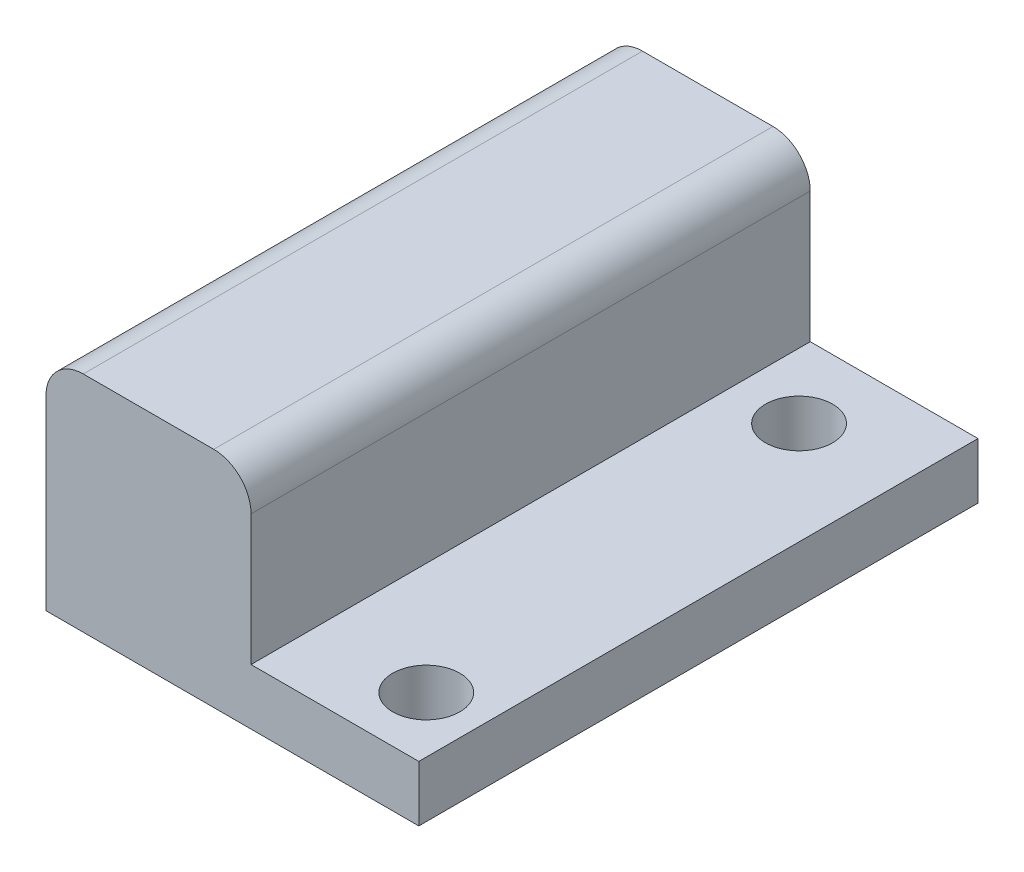
ISO-10303-21;
HEADER;
FILE_DESCRIPTION(('STEP AP214'),'2;1');
FILE_NAME('part.step','',(''),(''),'','','');
FILE_SCHEMA(('AUTOMOTIVE_DESIGN { 1 0 10303 214 1 1 1 1 }'));
ENDSEC;
DATA;
#1=APPLICATION_CONTEXT('core data for automotive mechanical design processes');
#2=APPLICATION_PROTOCOL_DEFINITION('international standard','automotive_design',2000,#1);
#3=PRODUCT_CONTEXT('',#1,'mechanical');
#4=PRODUCT('Part','Part','',(#3));
#5=PRODUCT_RELATED_PRODUCT_CATEGORY('part','',(#4));
#6=PRODUCT_DEFINITION_FORMATION('','',#4);
#7=PRODUCT_DEFINITION_CONTEXT('part definition',#1,'design');
#8=PRODUCT_DEFINITION('design','',#6,#7);
#9=PRODUCT_DEFINITION_SHAPE('','',#8);
#10=(LENGTH_UNIT() NAMED_UNIT(*) SI_UNIT(.MILLI.,.METRE.));
#11=(NAMED_UNIT(*) PLANE_ANGLE_UNIT() SI_UNIT($,.RADIAN.));
#12=(NAMED_UNIT(*) SI_UNIT($,.STERADIAN.) SOLID_ANGLE_UNIT());
#13=UNCERTAINTY_MEASURE_WITH_UNIT(LENGTH_MEASURE(1.E-05),#10,'distance_accuracy_value','');
#14=(GEOMETRIC_REPRESENTATION_CONTEXT(3) GLOBAL_UNCERTAINTY_ASSIGNED_CONTEXT((#13)) GLOBAL_UNIT_ASSIGNED_CONTEXT((#10,
#11,#12)) REPRESENTATION_CONTEXT('',''));
#15=CARTESIAN_POINT('',(0.,0.,0.));
#16=DIRECTION('',(0.,0.,1.));
#17=DIRECTION('',(1.,0.,0.));
#18=AXIS2_PLACEMENT_3D('',#15,#16,#17);
#19=CARTESIAN_POINT('',(0.,3.81,0.));
#20=DIRECTION('',(0.,1.,0.));
#21=DIRECTION('',(0.,0.,1.));
#22=AXIS2_PLACEMENT_3D('',#19,#20,#21);
#23=PLANE('',#22);
#24=DIRECTION('',(0.,0.,-1.));
#25=VECTOR('',#24,1.);
#26=CARTESIAN_POINT('',(-17.272,3.81,29.0764797605896));
#27=LINE('',#26,#25);
#28=CARTESIAN_POINT('',(-17.272,3.81,29.0764797605896));
#29=VERTEX_POINT('',#28);
#30=CARTESIAN_POINT('',(-17.272,3.81,-6.48352023941042));
#31=VERTEX_POINT('',#30);
#32=EDGE_CURVE('E192',#29,#31,#27,.T.);
#33=ORIENTED_EDGE('',*,*,#32,.F.);
#34=DIRECTION('',(-1.,0.,0.));
#35=VECTOR('',#34,1.);
#36=CARTESIAN_POINT('',(-8.382,3.81,29.0764797605896));
#37=LINE('',#36,#35);
#38=CARTESIAN_POINT('',(-8.382,3.81,29.0764797605896));
#39=VERTEX_POINT('',#38);
#40=EDGE_CURVE('E180',#39,#29,#37,.T.);
#41=ORIENTED_EDGE('',*,*,#40,.F.);
#42=DIRECTION('',(0.,0.,1.));
#43=VECTOR('',#42,1.);
#44=CARTESIAN_POINT('',(-8.382,3.81,-6.48352023941042));
#45=LINE('',#44,#43);
#46=CARTESIAN_POINT('',(-8.382,3.81,-6.48352023941042));
#47=VERTEX_POINT('',#46);
#48=EDGE_CURVE('E174',#47,#39,#45,.T.);
#49=ORIENTED_EDGE('',*,*,#48,.F.);
#50=DIRECTION('',(-1.,0.,0.));
#51=VECTOR('',#50,1.);
#52=CARTESIAN_POINT('',(-19.812,3.81,-6.48352023941042));
#53=LINE('',#52,#51);
#54=EDGE_CURVE('E170',#47,#31,#53,.T.);
#55=ORIENTED_EDGE('',*,*,#54,.T.);
#56=EDGE_LOOP('',(#33,#41,#49,#55));
#57=FACE_BOUND('',#56,.T.);
#58=ADVANCED_FACE('F45',(#57),#23,.T.);
#59=DIRECTION('',(0.,0.,-1.));
#60=VECTOR('',#59,1.);
#61=CARTESIAN_POINT('',(-5.842,3.81,31.6164797605896));
#62=LINE('',#61,#60);
#63=CARTESIAN_POINT('',(-5.842,3.81,31.6164797605896));
#64=VERTEX_POINT('',#63);
#65=CARTESIAN_POINT('',(-5.842,3.81,-6.48352023941042));
#66=VERTEX_POINT('',#65);
#67=EDGE_CURVE('E163',#64,#66,#62,.T.);
#68=ORIENTED_EDGE('',*,*,#67,.F.);
#69=DIRECTION('',(1.,0.,0.));
#70=VECTOR('',#69,1.);
#71=CARTESIAN_POINT('',(-19.812,3.81,31.6164797605896));
#72=LINE('',#71,#70);
#73=CARTESIAN_POINT('',(5.588,3.81,31.6164797605896));
#74=VERTEX_POINT('',#73);
#75=EDGE_CURVE('E226',#64,#74,#72,.T.);
#76=ORIENTED_EDGE('',*,*,#75,.T.);
#77=DIRECTION('',(0.,0.,-1.));
#78=VECTOR('',#77,1.);
#79=CARTESIAN_POINT('',(5.588,3.81,-6.48352023941042));
#80=LINE('',#79,#78);
#81=CARTESIAN_POINT('',(5.588,3.81,-6.48352023941042));
#82=VERTEX_POINT('',#81);
#83=EDGE_CURVE('E166',#74,#82,#80,.T.);
#84=ORIENTED_EDGE('',*,*,#83,.T.);
#85=EDGE_CURVE('E152',#82,#66,#53,.T.);
#86=ORIENTED_EDGE('',*,*,#85,.T.);
#87=EDGE_LOOP('',(#68,#76,#84,#86));
#88=FACE_BOUND('',#87,.T.);
#89=CARTESIAN_POINT('',(-1.397,3.81,-1.27652023941042));
#90=DIRECTION('',(0.,1.,0.));
#91=DIRECTION('',(0.,0.,1.));
#92=AXIS2_PLACEMENT_3D('',#89,#90,#91);
#93=CIRCLE('',#92,2.286);
#94=CARTESIAN_POINT('',(-1.397,3.81,-3.56252023941042));
#95=VERTEX_POINT('',#94);
#96=EDGE_CURVE('E218',#95,#95,#93,.T.);
#97=ORIENTED_EDGE('',*,*,#96,.F.);
#98=EDGE_LOOP('',(#97));
#99=FACE_BOUND('',#98,.T.);
#100=CARTESIAN_POINT('',(1.778,3.81,27.2984797605896));
#101=DIRECTION('',(0.,1.,0.));
#102=DIRECTION('',(0.,0.,1.));
#103=AXIS2_PLACEMENT_3D('',#100,#101,#102);
#104=CIRCLE('',#103,2.286);
#105=CARTESIAN_POINT('',(1.778,3.81,25.0124797605896));
#106=VERTEX_POINT('',#105);
#107=EDGE_CURVE('E210',#106,#106,#104,.T.);
#108=ORIENTED_EDGE('',*,*,#107,.F.);
#109=EDGE_LOOP('',(#108));
#110=FACE_BOUND('',#109,.T.);
#111=ADVANCED_FACE('F161',(#88,#99,#110),#23,.T.);
#112=CARTESIAN_POINT('',(0.,0.,0.));
#113=DIRECTION('',(0.,1.,0.));
#114=DIRECTION('',(0.,0.,1.));
#115=AXIS2_PLACEMENT_3D('',#112,#113,#114);
#116=PLANE('',#115);
#117=DIRECTION('',(0.,0.,1.));
#118=VECTOR('',#117,1.);
#119=CARTESIAN_POINT('',(-19.812,0.,-6.48352023941042));
#120=LINE('',#119,#118);
#121=CARTESIAN_POINT('',(-19.812,0.,-6.48352023941042));
#122=VERTEX_POINT('',#121);
#123=CARTESIAN_POINT('',(-19.812,0.,31.6164797605896));
#124=VERTEX_POINT('',#123);
#125=EDGE_CURVE('E222',#122,#124,#120,.T.);
#126=ORIENTED_EDGE('',*,*,#125,.F.);
#127=DIRECTION('',(-1.,0.,0.));
#128=VECTOR('',#127,1.);
#129=CARTESIAN_POINT('',(-19.812,0.,-6.48352023941042));
#130=LINE('',#129,#128);
#131=CARTESIAN_POINT('',(5.588,0.,-6.48352023941042));
#132=VERTEX_POINT('',#131);
#133=EDGE_CURVE('E229',#132,#122,#130,.T.);
#134=ORIENTED_EDGE('',*,*,#133,.F.);
#135=DIRECTION('',(0.,0.,-1.));
#136=VECTOR('',#135,1.);
#137=CARTESIAN_POINT('',(5.588,0.,-6.48352023941042));
#138=LINE('',#137,#136);
#139=CARTESIAN_POINT('',(5.588,0.,31.6164797605896));
#140=VERTEX_POINT('',#139);
#141=EDGE_CURVE('E238',#140,#132,#138,.T.);
#142=ORIENTED_EDGE('',*,*,#141,.F.);
#143=DIRECTION('',(1.,0.,0.));
#144=VECTOR('',#143,1.);
#145=CARTESIAN_POINT('',(-19.812,0.,31.6164797605896));
#146=LINE('',#145,#144);
#147=EDGE_CURVE('E235',#124,#140,#146,.T.);
#148=ORIENTED_EDGE('',*,*,#147,.F.);
#149=EDGE_LOOP('',(#126,#134,#142,#148));
#150=FACE_BOUND('',#149,.T.);
#151=CARTESIAN_POINT('',(-1.397,0.,-1.27652023941042));
#152=DIRECTION('',(0.,1.,0.));
#153=DIRECTION('',(0.,0.,1.));
#154=AXIS2_PLACEMENT_3D('',#151,#152,#153);
#155=CIRCLE('',#154,2.286);
#156=CARTESIAN_POINT('',(-1.397,0.,-3.56252023941042));
#157=VERTEX_POINT('',#156);
#158=EDGE_CURVE('E214',#157,#157,#155,.T.);
#159=ORIENTED_EDGE('',*,*,#158,.T.);
#160=EDGE_LOOP('',(#159));
#161=FACE_BOUND('',#160,.T.);
#162=CARTESIAN_POINT('',(1.778,0.,27.2984797605896));
#163=DIRECTION('',(0.,1.,0.));
#164=DIRECTION('',(0.,0.,1.));
#165=AXIS2_PLACEMENT_3D('',#162,#163,#164);
#166=CIRCLE('',#165,2.286);
#167=CARTESIAN_POINT('',(1.778,0.,25.0124797605896));
#168=VERTEX_POINT('',#167);
#169=EDGE_CURVE('E209',#168,#168,#166,.T.);
#170=ORIENTED_EDGE('',*,*,#169,.T.);
#171=EDGE_LOOP('',(#170));
#172=FACE_BOUND('',#171,.T.);
#173=ADVANCED_FACE('F327',(#150,#161,#172),#116,.F.);
#174=CARTESIAN_POINT('',(-19.812,3.81,-6.48352023941042));
#175=DIRECTION('',(1.,0.,0.));
#176=DIRECTION('',(0.,0.,-1.));
#177=AXIS2_PLACEMENT_3D('',#174,#175,#176);
#178=PLANE('',#177);
#179=DIRECTION('',(0.,-1.,0.));
#180=VECTOR('',#179,1.);
#181=CARTESIAN_POINT('',(-19.812,3.81,31.6164797605896));
#182=LINE('',#181,#180);
#183=CARTESIAN_POINT('',(-19.812,12.7,31.6164797605896));
#184=VERTEX_POINT('',#183);
#185=EDGE_CURVE('E253',#184,#124,#182,.T.);
#186=ORIENTED_EDGE('',*,*,#185,.F.);
#187=DIRECTION('',(0.,0.,1.));
#188=VECTOR('',#187,1.);
#189=CARTESIAN_POINT('',(-19.812,12.7,-6.48352023941042));
#190=LINE('',#189,#188);
#191=CARTESIAN_POINT('',(-19.812,12.7,-6.48352023941042));
#192=VERTEX_POINT('',#191);
#193=EDGE_CURVE('E11',#184,#192,#190,.F.);
#194=ORIENTED_EDGE('',*,*,#193,.T.);
#195=DIRECTION('',(0.,-1.,0.));
#196=VECTOR('',#195,1.);
#197=CARTESIAN_POINT('',(-19.812,3.81,-6.48352023941042));
#198=LINE('',#197,#196);
#199=EDGE_CURVE('E169',#192,#122,#198,.T.);
#200=ORIENTED_EDGE('',*,*,#199,.T.);
#201=ORIENTED_EDGE('',*,*,#125,.T.);
#202=EDGE_LOOP('',(#186,#194,#200,#201));
#203=FACE_BOUND('',#202,.T.);
#204=ADVANCED_FACE('F335',(#203),#178,.F.);
#205=CARTESIAN_POINT('',(-19.812,3.81,31.6164797605896));
#206=DIRECTION('',(0.,0.,-1.));
#207=DIRECTION('',(-1.,0.,0.));
#208=AXIS2_PLACEMENT_3D('',#205,#206,#207);
#209=PLANE('',#208);
#210=DIRECTION('',(0.,-1.,0.));
#211=VECTOR('',#210,1.);
#212=CARTESIAN_POINT('',(-5.842,12.7,31.6164797605896));
#213=LINE('',#212,#211);
#214=CARTESIAN_POINT('',(-5.842,12.7,31.6164797605896));
#215=VERTEX_POINT('',#214);
#216=EDGE_CURVE('E156',#215,#64,#213,.T.);
#217=ORIENTED_EDGE('',*,*,#216,.F.);
#218=CARTESIAN_POINT('',(-8.382,12.7,31.6164797605896));
#219=DIRECTION('',(0.,0.,-1.));
#220=DIRECTION('',(-1.,0.,0.));
#221=AXIS2_PLACEMENT_3D('',#218,#219,#220);
#222=CIRCLE('',#221,2.54);
#223=CARTESIAN_POINT('',(-8.382,15.24,31.6164797605896));
#224=VERTEX_POINT('',#223);
#225=EDGE_CURVE('E54',#215,#224,#222,.F.);
#226=ORIENTED_EDGE('',*,*,#225,.T.);
#227=DIRECTION('',(1.,0.,0.));
#228=VECTOR('',#227,1.);
#229=CARTESIAN_POINT('',(-19.812,15.24,31.6164797605896));
#230=LINE('',#229,#228);
#231=CARTESIAN_POINT('',(-17.272,15.24,31.6164797605896));
#232=VERTEX_POINT('',#231);
#233=EDGE_CURVE('E183',#232,#224,#230,.T.);
#234=ORIENTED_EDGE('',*,*,#233,.F.);
#235=CARTESIAN_POINT('',(-17.272,12.7,31.6164797605896));
#236=DIRECTION('',(0.,0.,-1.));
#237=DIRECTION('',(-1.,0.,0.));
#238=AXIS2_PLACEMENT_3D('',#235,#236,#237);
#239=CIRCLE('',#238,2.54);
#240=EDGE_CURVE('E61',#232,#184,#239,.F.);
#241=ORIENTED_EDGE('',*,*,#240,.T.);
#242=ORIENTED_EDGE('',*,*,#185,.T.);
#243=ORIENTED_EDGE('',*,*,#147,.T.);
#244=DIRECTION('',(0.,-1.,0.));
#245=VECTOR('',#244,1.);
#246=CARTESIAN_POINT('',(5.588,3.81,31.6164797605896));
#247=LINE('',#246,#245);
#248=EDGE_CURVE('E249',#74,#140,#247,.T.);
#249=ORIENTED_EDGE('',*,*,#248,.F.);
#250=ORIENTED_EDGE('',*,*,#75,.F.);
#251=EDGE_LOOP('',(#217,#226,#234,#241,#242,#243,#249,#250));
#252=FACE_BOUND('',#251,.T.);
#253=ADVANCED_FACE('F301',(#252),#209,.F.);
#254=CARTESIAN_POINT('',(5.588,3.81,-6.48352023941042));
#255=DIRECTION('',(-1.,0.,0.));
#256=DIRECTION('',(0.,0.,1.));
#257=AXIS2_PLACEMENT_3D('',#254,#255,#256);
#258=PLANE('',#257);
#259=ORIENTED_EDGE('',*,*,#141,.T.);
#260=DIRECTION('',(0.,-1.,0.));
#261=VECTOR('',#260,1.);
#262=CARTESIAN_POINT('',(5.588,3.81,-6.48352023941042));
#263=LINE('',#262,#261);
#264=EDGE_CURVE('E246',#82,#132,#263,.T.);
#265=ORIENTED_EDGE('',*,*,#264,.F.);
#266=ORIENTED_EDGE('',*,*,#83,.F.);
#267=ORIENTED_EDGE('',*,*,#248,.T.);
#268=EDGE_LOOP('',(#259,#265,#266,#267));
#269=FACE_BOUND('',#268,.T.);
#270=ADVANCED_FACE('F339',(#269),#258,.F.);
#271=CARTESIAN_POINT('',(-19.812,3.81,-6.48352023941042));
#272=DIRECTION('',(0.,0.,1.));
#273=DIRECTION('',(1.,0.,0.));
#274=AXIS2_PLACEMENT_3D('',#271,#272,#273);
#275=PLANE('',#274);
#276=DIRECTION('',(-1.,0.,0.));
#277=VECTOR('',#276,1.);
#278=CARTESIAN_POINT('',(-19.812,15.24,-6.48352023941042));
#279=LINE('',#278,#277);
#280=CARTESIAN_POINT('',(-8.382,15.24,-6.48352023941042));
#281=VERTEX_POINT('',#280);
#282=CARTESIAN_POINT('',(-17.272,15.24,-6.48352023941042));
#283=VERTEX_POINT('',#282);
#284=EDGE_CURVE('E175',#281,#283,#279,.T.);
#285=ORIENTED_EDGE('',*,*,#284,.F.);
#286=CARTESIAN_POINT('',(-8.382,12.7,-6.48352023941042));
#287=DIRECTION('',(0.,0.,1.));
#288=DIRECTION('',(1.,0.,0.));
#289=AXIS2_PLACEMENT_3D('',#286,#287,#288);
#290=CIRCLE('',#289,2.54);
#291=CARTESIAN_POINT('',(-5.842,12.7,-6.48352023941042));
#292=VERTEX_POINT('',#291);
#293=EDGE_CURVE('E153',#281,#292,#290,.F.);
#294=ORIENTED_EDGE('',*,*,#293,.T.);
#295=DIRECTION('',(0.,-1.,0.));
#296=VECTOR('',#295,1.);
#297=CARTESIAN_POINT('',(-5.842,12.7,-6.48352023941042));
#298=LINE('',#297,#296);
#299=EDGE_CURVE('E146',#292,#66,#298,.T.);
#300=ORIENTED_EDGE('',*,*,#299,.T.);
#301=ORIENTED_EDGE('',*,*,#85,.F.);
#302=ORIENTED_EDGE('',*,*,#264,.T.);
#303=ORIENTED_EDGE('',*,*,#133,.T.);
#304=ORIENTED_EDGE('',*,*,#199,.F.);
#305=CARTESIAN_POINT('',(-17.272,12.7,-6.48352023941042));
#306=DIRECTION('',(0.,0.,1.));
#307=DIRECTION('',(1.,0.,0.));
#308=AXIS2_PLACEMENT_3D('',#305,#306,#307);
#309=CIRCLE('',#308,2.54);
#310=EDGE_CURVE('E290',#192,#283,#309,.F.);
#311=ORIENTED_EDGE('',*,*,#310,.T.);
#312=EDGE_LOOP('',(#285,#294,#300,#301,#302,#303,#304,#311));
#313=FACE_BOUND('',#312,.T.);
#314=DIRECTION('',(0.,-1.,0.));
#315=VECTOR('',#314,1.);
#316=CARTESIAN_POINT('',(-8.382,12.7,-6.48352023941042));
#317=LINE('',#316,#315);
#318=CARTESIAN_POINT('',(-8.382,11.43,-6.48352023941042));
#319=VERTEX_POINT('',#318);
#320=EDGE_CURVE('E157',#319,#47,#317,.T.);
#321=ORIENTED_EDGE('',*,*,#320,.F.);
#322=DIRECTION('',(0.707106781186551,-0.707106781186544,0.));
#323=VECTOR('',#322,1.);
#324=CARTESIAN_POINT('',(-10.2870000000001,13.335,-6.48352023941042));
#325=LINE('',#324,#323);
#326=CARTESIAN_POINT('',(-9.652,12.7,-6.48352023941042));
#327=VERTEX_POINT('',#326);
#328=EDGE_CURVE('E276',#319,#327,#325,.F.);
#329=ORIENTED_EDGE('',*,*,#328,.T.);
#330=DIRECTION('',(-1.,0.,0.));
#331=VECTOR('',#330,1.);
#332=CARTESIAN_POINT('',(-19.812,12.7,-6.48352023941042));
#333=LINE('',#332,#331);
#334=CARTESIAN_POINT('',(-16.002,12.7,-6.48352023941042));
#335=VERTEX_POINT('',#334);
#336=EDGE_CURVE('E308',#327,#335,#333,.T.);
#337=ORIENTED_EDGE('',*,*,#336,.T.);
#338=DIRECTION('',(0.707106781186551,0.707106781186544,0.));
#339=VECTOR('',#338,1.);
#340=CARTESIAN_POINT('',(-22.352,6.35000000000004,-6.48352023941042));
#341=LINE('',#340,#339);
#342=CARTESIAN_POINT('',(-17.272,11.43,-6.48352023941042));
#343=VERTEX_POINT('',#342);
#344=EDGE_CURVE('E279',#335,#343,#341,.F.);
#345=ORIENTED_EDGE('',*,*,#344,.T.);
#346=DIRECTION('',(0.,-1.,0.));
#347=VECTOR('',#346,1.);
#348=CARTESIAN_POINT('',(-17.272,12.7,-6.48352023941042));
#349=LINE('',#348,#347);
#350=EDGE_CURVE('E196',#343,#31,#349,.T.);
#351=ORIENTED_EDGE('',*,*,#350,.T.);
#352=ORIENTED_EDGE('',*,*,#54,.F.);
#353=EDGE_LOOP('',(#321,#329,#337,#345,#351,#352));
#354=FACE_BOUND('',#353,.T.);
#355=ADVANCED_FACE('F149',(#313,#354),#275,.F.);
#356=CARTESIAN_POINT('',(-1.397,3.81,-1.27652023941042));
#357=DIRECTION('',(0.,-1.,0.));
#358=DIRECTION('',(0.,0.,-1.));
#359=AXIS2_PLACEMENT_3D('',#356,#357,#358);
#360=CYLINDRICAL_SURFACE('',#359,2.286);
#361=CARTESIAN_POINT('',(-1.397,3.81,-3.56252023941042));
#362=CARTESIAN_POINT('',(-1.397,3.7703125,-3.56252023941042));
#363=CARTESIAN_POINT('',(-1.397,3.730625,-3.56252023941042));
#364=CARTESIAN_POINT('',(-1.397,3.65125,-3.56252023941042));
#365=CARTESIAN_POINT('',(-1.397,3.6115625,-3.56252023941042));
#366=CARTESIAN_POINT('',(-1.397,3.5321875,-3.56252023941042));
#367=CARTESIAN_POINT('',(-1.397,3.4925,-3.56252023941042));
#368=CARTESIAN_POINT('',(-1.397,3.413125,-3.56252023941042));
#369=CARTESIAN_POINT('',(-1.397,3.3734375,-3.56252023941042));
#370=CARTESIAN_POINT('',(-1.397,3.2940625,-3.56252023941042));
#371=CARTESIAN_POINT('',(-1.397,3.254375,-3.56252023941042));
#372=CARTESIAN_POINT('',(-1.397,3.175,-3.56252023941042));
#373=CARTESIAN_POINT('',(-1.397,3.1353125,-3.56252023941042));
#374=CARTESIAN_POINT('',(-1.397,3.0559375,-3.56252023941042));
#375=CARTESIAN_POINT('',(-1.397,3.01625,-3.56252023941042));
#376=CARTESIAN_POINT('',(-1.397,2.936875,-3.56252023941042));
#377=CARTESIAN_POINT('',(-1.397,2.8971875,-3.56252023941042));
#378=CARTESIAN_POINT('',(-1.397,2.8178125,-3.56252023941042));
#379=CARTESIAN_POINT('',(-1.397,2.778125,-3.56252023941042));
#380=CARTESIAN_POINT('',(-1.397,2.69875,-3.56252023941042));
#381=CARTESIAN_POINT('',(-1.397,2.6590625,-3.56252023941042));
#382=CARTESIAN_POINT('',(-1.397,2.5796875,-3.56252023941042));
#383=CARTESIAN_POINT('',(-1.397,2.54,-3.56252023941042));
#384=CARTESIAN_POINT('',(-1.397,2.460625,-3.56252023941042));
#385=CARTESIAN_POINT('',(-1.397,2.4209375,-3.56252023941042));
#386=CARTESIAN_POINT('',(-1.397,2.3415625,-3.56252023941042));
#387=CARTESIAN_POINT('',(-1.397,2.301875,-3.56252023941042));
#388=CARTESIAN_POINT('',(-1.397,2.2225,-3.56252023941042));
#389=CARTESIAN_POINT('',(-1.397,2.1828125,-3.56252023941042));
#390=CARTESIAN_POINT('',(-1.397,2.1034375,-3.56252023941042));
#391=CARTESIAN_POINT('',(-1.397,2.06375,-3.56252023941042));
#392=CARTESIAN_POINT('',(-1.397,1.984375,-3.56252023941042));
#393=CARTESIAN_POINT('',(-1.397,1.9446875,-3.56252023941042));
#394=CARTESIAN_POINT('',(-1.397,1.8653125,-3.56252023941042));
#395=CARTESIAN_POINT('',(-1.397,1.825625,-3.56252023941042));
#396=CARTESIAN_POINT('',(-1.397,1.74625,-3.56252023941042));
#397=CARTESIAN_POINT('',(-1.397,1.7065625,-3.56252023941042));
#398=CARTESIAN_POINT('',(-1.397,1.6271875,-3.56252023941042));
#399=CARTESIAN_POINT('',(-1.397,1.5875,-3.56252023941042));
#400=CARTESIAN_POINT('',(-1.397,1.508125,-3.56252023941042));
#401=CARTESIAN_POINT('',(-1.397,1.4684375,-3.56252023941042));
#402=CARTESIAN_POINT('',(-1.397,1.3890625,-3.56252023941042));
#403=CARTESIAN_POINT('',(-1.397,1.349375,-3.56252023941042));
#404=CARTESIAN_POINT('',(-1.397,1.27,-3.56252023941042));
#405=CARTESIAN_POINT('',(-1.397,1.2303125,-3.56252023941042));
#406=CARTESIAN_POINT('',(-1.397,1.1509375,-3.56252023941042));
#407=CARTESIAN_POINT('',(-1.397,1.11125,-3.56252023941042));
#408=CARTESIAN_POINT('',(-1.397,1.031875,-3.56252023941042));
#409=CARTESIAN_POINT('',(-1.397,0.9921875,-3.56252023941042));
#410=CARTESIAN_POINT('',(-1.397,0.9128125,-3.56252023941042));
#411=CARTESIAN_POINT('',(-1.397,0.873125,-3.56252023941042));
#412=CARTESIAN_POINT('',(-1.397,0.79375,-3.56252023941042));
#413=CARTESIAN_POINT('',(-1.397,0.7540625,-3.56252023941042));
#414=CARTESIAN_POINT('',(-1.397,0.6746875,-3.56252023941042));
#415=CARTESIAN_POINT('',(-1.397,0.635,-3.56252023941042));
#416=CARTESIAN_POINT('',(-1.397,0.555625,-3.56252023941042));
#417=CARTESIAN_POINT('',(-1.397,0.5159375,-3.56252023941042));
#418=CARTESIAN_POINT('',(-1.397,0.4365625,-3.56252023941042));
#419=CARTESIAN_POINT('',(-1.397,0.396875,-3.56252023941042));
#420=CARTESIAN_POINT('',(-1.397,0.3175,-3.56252023941042));
#421=CARTESIAN_POINT('',(-1.397,0.2778125,-3.56252023941042));
#422=CARTESIAN_POINT('',(-1.397,0.1984375,-3.56252023941042));
#423=CARTESIAN_POINT('',(-1.397,0.15875,-3.56252023941042));
#424=CARTESIAN_POINT('',(-1.397,0.0793749999999999,-3.56252023941042));
#425=CARTESIAN_POINT('',(-1.397,0.0396874999999999,-3.56252023941042));
#426=CARTESIAN_POINT('',(-1.397,0.,-3.56252023941042));
#427=B_SPLINE_CURVE_WITH_KNOTS('',3,(#361,#362,#363,#364,#365,#366,#367,#368,#369,#370,#371,
#372,#373,#374,#375,#376,#377,#378,#379,#380,#381,#382,#383,#384,#385,#386,#387,#388,#389,#390,
#391,#392,#393,#394,#395,#396,#397,#398,#399,#400,#401,#402,#403,#404,#405,#406,#407,#408,#409,
#410,#411,#412,#413,#414,#415,#416,#417,#418,#419,#420,#421,#422,#423,#424,#425,#426),
.UNSPECIFIED.,.F.,.F.,(4,2,2,2,2,2,2,2,2,2,2,2,2,2,2,2,2,2,2,2,2,2,2,2,2,2,2,2,2,2,2,2,4),(0.,
0.1190625,0.238125,0.3571875,0.47625,0.5953125,0.714375,0.8334375,0.9525,1.0715625,1.190625,
1.3096875,1.42875,1.5478125,1.666875,1.7859375,1.905,2.0240625,2.143125,2.2621875,2.38125,
2.5003125,2.619375,2.7384375,2.8575,2.9765625,3.095625,3.2146875,3.33375,3.4528125,3.571875,
3.6909375,3.81),.UNSPECIFIED.);
#428=EDGE_CURVE('BSEAM331',#95,#157,#427,.T.);
#429=ORIENTED_EDGE('',*,*,#96,.T.);
#430=ORIENTED_EDGE('',*,*,#158,.F.);
#431=ORIENTED_EDGE('',*,*,#428,.T.);
#432=ORIENTED_EDGE('',*,*,#428,.F.);
#433=EDGE_LOOP('',(#429,#431,#430,#432));
#434=FACE_BOUND('',#433,.T.);
#435=ADVANCED_FACE('F331',(#434),#360,.F.);
#436=CARTESIAN_POINT('',(1.778,3.81,27.2984797605896));
#437=DIRECTION('',(0.,-1.,0.));
#438=DIRECTION('',(0.,0.,-1.));
#439=AXIS2_PLACEMENT_3D('',#436,#437,#438);
#440=CYLINDRICAL_SURFACE('',#439,2.286);
#441=CARTESIAN_POINT('',(1.778,3.81,25.0124797605896));
#442=CARTESIAN_POINT('',(1.778,3.7703125,25.0124797605896));
#443=CARTESIAN_POINT('',(1.778,3.730625,25.0124797605896));
#444=CARTESIAN_POINT('',(1.778,3.65125,25.0124797605896));
#445=CARTESIAN_POINT('',(1.778,3.6115625,25.0124797605896));
#446=CARTESIAN_POINT('',(1.778,3.5321875,25.0124797605896));
#447=CARTESIAN_POINT('',(1.778,3.4925,25.0124797605896));
#448=CARTESIAN_POINT('',(1.778,3.413125,25.0124797605896));
#449=CARTESIAN_POINT('',(1.778,3.3734375,25.0124797605896));
#450=CARTESIAN_POINT('',(1.778,3.2940625,25.0124797605896));
#451=CARTESIAN_POINT('',(1.778,3.254375,25.0124797605896));
#452=CARTESIAN_POINT('',(1.778,3.175,25.0124797605896));
#453=CARTESIAN_POINT('',(1.778,3.1353125,25.0124797605896));
#454=CARTESIAN_POINT('',(1.778,3.0559375,25.0124797605896));
#455=CARTESIAN_POINT('',(1.778,3.01625,25.0124797605896));
#456=CARTESIAN_POINT('',(1.778,2.936875,25.0124797605896));
#457=CARTESIAN_POINT('',(1.778,2.8971875,25.0124797605896));
#458=CARTESIAN_POINT('',(1.778,2.8178125,25.0124797605896));
#459=CARTESIAN_POINT('',(1.778,2.778125,25.0124797605896));
#460=CARTESIAN_POINT('',(1.778,2.69875,25.0124797605896));
#461=CARTESIAN_POINT('',(1.778,2.6590625,25.0124797605896));
#462=CARTESIAN_POINT('',(1.778,2.5796875,25.0124797605896));
#463=CARTESIAN_POINT('',(1.778,2.54,25.0124797605896));
#464=CARTESIAN_POINT('',(1.778,2.460625,25.0124797605896));
#465=CARTESIAN_POINT('',(1.778,2.4209375,25.0124797605896));
#466=CARTESIAN_POINT('',(1.778,2.3415625,25.0124797605896));
#467=CARTESIAN_POINT('',(1.778,2.301875,25.0124797605896));
#468=CARTESIAN_POINT('',(1.778,2.2225,25.0124797605896));
#469=CARTESIAN_POINT('',(1.778,2.1828125,25.0124797605896));
#470=CARTESIAN_POINT('',(1.778,2.1034375,25.0124797605896));
#471=CARTESIAN_POINT('',(1.778,2.06375,25.0124797605896));
#472=CARTESIAN_POINT('',(1.778,1.984375,25.0124797605896));
#473=CARTESIAN_POINT('',(1.778,1.9446875,25.0124797605896));
#474=CARTESIAN_POINT('',(1.778,1.8653125,25.0124797605896));
#475=CARTESIAN_POINT('',(1.778,1.825625,25.0124797605896));
#476=CARTESIAN_POINT('',(1.778,1.74625,25.0124797605896));
#477=CARTESIAN_POINT('',(1.778,1.7065625,25.0124797605896));
#478=CARTESIAN_POINT('',(1.778,1.6271875,25.0124797605896));
#479=CARTESIAN_POINT('',(1.778,1.5875,25.0124797605896));
#480=CARTESIAN_POINT('',(1.778,1.508125,25.0124797605896));
#481=CARTESIAN_POINT('',(1.778,1.4684375,25.0124797605896));
#482=CARTESIAN_POINT('',(1.778,1.3890625,25.0124797605896));
#483=CARTESIAN_POINT('',(1.778,1.349375,25.0124797605896));
#484=CARTESIAN_POINT('',(1.778,1.27,25.0124797605896));
#485=CARTESIAN_POINT('',(1.778,1.2303125,25.0124797605896));
#486=CARTESIAN_POINT('',(1.778,1.1509375,25.0124797605896));
#487=CARTESIAN_POINT('',(1.778,1.11125,25.0124797605896));
#488=CARTESIAN_POINT('',(1.778,1.031875,25.0124797605896));
#489=CARTESIAN_POINT('',(1.778,0.9921875,25.0124797605896));
#490=CARTESIAN_POINT('',(1.778,0.9128125,25.0124797605896));
#491=CARTESIAN_POINT('',(1.778,0.873125,25.0124797605896));
#492=CARTESIAN_POINT('',(1.778,0.79375,25.0124797605896));
#493=CARTESIAN_POINT('',(1.778,0.7540625,25.0124797605896));
#494=CARTESIAN_POINT('',(1.778,0.6746875,25.0124797605896));
#495=CARTESIAN_POINT('',(1.778,0.635,25.0124797605896));
#496=CARTESIAN_POINT('',(1.778,0.555625,25.0124797605896));
#497=CARTESIAN_POINT('',(1.778,0.5159375,25.0124797605896));
#498=CARTESIAN_POINT('',(1.778,0.4365625,25.0124797605896));
#499=CARTESIAN_POINT('',(1.778,0.396875,25.0124797605896));
#500=CARTESIAN_POINT('',(1.778,0.3175,25.0124797605896));
#501=CARTESIAN_POINT('',(1.778,0.2778125,25.0124797605896));
#502=CARTESIAN_POINT('',(1.778,0.1984375,25.0124797605896));
#503=CARTESIAN_POINT('',(1.778,0.15875,25.0124797605896));
#504=CARTESIAN_POINT('',(1.778,0.0793749999999999,25.0124797605896));
#505=CARTESIAN_POINT('',(1.778,0.0396874999999999,25.0124797605896));
#506=CARTESIAN_POINT('',(1.778,0.,25.0124797605896));
#507=B_SPLINE_CURVE_WITH_KNOTS('',3,(#441,#442,#443,#444,#445,#446,#447,#448,#449,#450,#451,
#452,#453,#454,#455,#456,#457,#458,#459,#460,#461,#462,#463,#464,#465,#466,#467,#468,#469,#470,
#471,#472,#473,#474,#475,#476,#477,#478,#479,#480,#481,#482,#483,#484,#485,#486,#487,#488,#489,
#490,#491,#492,#493,#494,#495,#496,#497,#498,#499,#500,#501,#502,#503,#504,#505,#506),
.UNSPECIFIED.,.F.,.F.,(4,2,2,2,2,2,2,2,2,2,2,2,2,2,2,2,2,2,2,2,2,2,2,2,2,2,2,2,2,2,2,2,4),(0.,
0.1190625,0.238125,0.3571875,0.47625,0.5953125,0.714375,0.8334375,0.9525,1.0715625,1.190625,
1.3096875,1.42875,1.5478125,1.666875,1.7859375,1.905,2.0240625,2.143125,2.2621875,2.38125,
2.5003125,2.619375,2.7384375,2.8575,2.9765625,3.095625,3.2146875,3.33375,3.4528125,3.571875,
3.6909375,3.81),.UNSPECIFIED.);
#508=EDGE_CURVE('BSEAM396',#106,#168,#507,.T.);
#509=ORIENTED_EDGE('',*,*,#107,.T.);
#510=ORIENTED_EDGE('',*,*,#169,.F.);
#511=ORIENTED_EDGE('',*,*,#508,.T.);
#512=ORIENTED_EDGE('',*,*,#508,.F.);
#513=EDGE_LOOP('',(#509,#511,#510,#512));
#514=FACE_BOUND('',#513,.T.);
#515=ADVANCED_FACE('F396',(#514),#440,.F.);
#516=CARTESIAN_POINT('',(-5.842,12.7,31.6164797605896));
#517=DIRECTION('',(-1.,0.,0.));
#518=DIRECTION('',(0.,0.,1.));
#519=AXIS2_PLACEMENT_3D('',#516,#517,#518);
#520=PLANE('',#519);
#521=ORIENTED_EDGE('',*,*,#299,.F.);
#522=DIRECTION('',(0.,0.,-1.));
#523=VECTOR('',#522,1.);
#524=CARTESIAN_POINT('',(-5.842,12.7,31.6164797605896));
#525=LINE('',#524,#523);
#526=EDGE_CURVE('E69',#292,#215,#525,.F.);
#527=ORIENTED_EDGE('',*,*,#526,.T.);
#528=ORIENTED_EDGE('',*,*,#216,.T.);
#529=ORIENTED_EDGE('',*,*,#67,.T.);
#530=EDGE_LOOP('',(#521,#527,#528,#529));
#531=FACE_BOUND('',#530,.T.);
#532=ADVANCED_FACE('F172',(#531),#520,.F.);
#533=CARTESIAN_POINT('',(-8.382,12.7,-6.48352023941042));
#534=DIRECTION('',(1.,0.,0.));
#535=DIRECTION('',(0.,0.,-1.));
#536=AXIS2_PLACEMENT_3D('',#533,#534,#535);
#537=PLANE('',#536);
#538=DIRECTION('',(0.,-1.,0.));
#539=VECTOR('',#538,1.);
#540=CARTESIAN_POINT('',(-8.382,12.7,29.0764797605896));
#541=LINE('',#540,#539);
#542=CARTESIAN_POINT('',(-8.382,11.43,29.0764797605896));
#543=VERTEX_POINT('',#542);
#544=EDGE_CURVE('E202',#543,#39,#541,.T.);
#545=ORIENTED_EDGE('',*,*,#544,.F.);
#546=DIRECTION('',(0.,0.,-1.));
#547=VECTOR('',#546,1.);
#548=CARTESIAN_POINT('',(-8.382,11.43,-6.48352023941042));
#549=LINE('',#548,#547);
#550=EDGE_CURVE('E270',#543,#319,#549,.T.);
#551=ORIENTED_EDGE('',*,*,#550,.T.);
#552=ORIENTED_EDGE('',*,*,#320,.T.);
#553=ORIENTED_EDGE('',*,*,#48,.T.);
#554=EDGE_LOOP('',(#545,#551,#552,#553));
#555=FACE_BOUND('',#554,.T.);
#556=ADVANCED_FACE('F386',(#555),#537,.F.);
#557=CARTESIAN_POINT('',(-8.382,12.7,29.0764797605896));
#558=DIRECTION('',(0.,0.,1.));
#559=DIRECTION('',(1.,0.,0.));
#560=AXIS2_PLACEMENT_3D('',#557,#558,#559);
#561=PLANE('',#560);
#562=DIRECTION('',(-1.,0.,0.));
#563=VECTOR('',#562,1.);
#564=CARTESIAN_POINT('',(-8.382,12.7,29.0764797605896));
#565=LINE('',#564,#563);
#566=CARTESIAN_POINT('',(-9.652,12.7,29.0764797605896));
#567=VERTEX_POINT('',#566);
#568=CARTESIAN_POINT('',(-16.002,12.7,29.0764797605896));
#569=VERTEX_POINT('',#568);
#570=EDGE_CURVE('E186',#567,#569,#565,.T.);
#571=ORIENTED_EDGE('',*,*,#570,.F.);
#572=DIRECTION('',(-0.707106781186551,0.707106781186544,0.));
#573=VECTOR('',#572,1.);
#574=CARTESIAN_POINT('',(-9.652,12.7,29.0764797605896));
#575=LINE('',#574,#573);
#576=EDGE_CURVE('E267',#567,#543,#575,.F.);
#577=ORIENTED_EDGE('',*,*,#576,.T.);
#578=ORIENTED_EDGE('',*,*,#544,.T.);
#579=ORIENTED_EDGE('',*,*,#40,.T.);
#580=DIRECTION('',(0.,-1.,0.));
#581=VECTOR('',#580,1.);
#582=CARTESIAN_POINT('',(-17.272,12.7,29.0764797605896));
#583=LINE('',#582,#581);
#584=CARTESIAN_POINT('',(-17.272,11.43,29.0764797605896));
#585=VERTEX_POINT('',#584);
#586=EDGE_CURVE('E199',#585,#29,#583,.T.);
#587=ORIENTED_EDGE('',*,*,#586,.F.);
#588=DIRECTION('',(-0.707106781186551,-0.707106781186544,0.));
#589=VECTOR('',#588,1.);
#590=CARTESIAN_POINT('',(-16.002,12.7,29.0764797605896));
#591=LINE('',#590,#589);
#592=EDGE_CURVE('E264',#585,#569,#591,.F.);
#593=ORIENTED_EDGE('',*,*,#592,.T.);
#594=EDGE_LOOP('',(#571,#577,#578,#579,#587,#593));
#595=FACE_BOUND('',#594,.T.);
#596=ADVANCED_FACE('F383',(#595),#561,.F.);
#597=CARTESIAN_POINT('',(-17.272,12.7,29.0764797605896));
#598=DIRECTION('',(-1.,0.,0.));
#599=DIRECTION('',(0.,0.,1.));
#600=AXIS2_PLACEMENT_3D('',#597,#598,#599);
#601=PLANE('',#600);
#602=ORIENTED_EDGE('',*,*,#350,.F.);
#603=DIRECTION('',(0.,0.,1.));
#604=VECTOR('',#603,1.);
#605=CARTESIAN_POINT('',(-17.272,11.43,29.0764797605896));
#606=LINE('',#605,#604);
#607=EDGE_CURVE('E273',#343,#585,#606,.T.);
#608=ORIENTED_EDGE('',*,*,#607,.T.);
#609=ORIENTED_EDGE('',*,*,#586,.T.);
#610=ORIENTED_EDGE('',*,*,#32,.T.);
#611=EDGE_LOOP('',(#602,#608,#609,#610));
#612=FACE_BOUND('',#611,.T.);
#613=ADVANCED_FACE('F378',(#612),#601,.F.);
#614=CARTESIAN_POINT('',(0.,12.7,0.));
#615=DIRECTION('',(0.,1.,0.));
#616=DIRECTION('',(0.,0.,1.));
#617=AXIS2_PLACEMENT_3D('',#614,#615,#616);
#618=PLANE('',#617);
#619=ORIENTED_EDGE('',*,*,#336,.F.);
#620=DIRECTION('',(0.,0.,1.));
#621=VECTOR('',#620,1.);
#622=CARTESIAN_POINT('',(-9.652,12.7,29.0764797605896));
#623=LINE('',#622,#621);
#624=EDGE_CURVE('E260',#327,#567,#623,.T.);
#625=ORIENTED_EDGE('',*,*,#624,.T.);
#626=ORIENTED_EDGE('',*,*,#570,.T.);
#627=DIRECTION('',(0.,0.,-1.));
#628=VECTOR('',#627,1.);
#629=CARTESIAN_POINT('',(-16.002,12.7,-6.48352023941042));
#630=LINE('',#629,#628);
#631=EDGE_CURVE('E256',#569,#335,#630,.T.);
#632=ORIENTED_EDGE('',*,*,#631,.T.);
#633=EDGE_LOOP('',(#619,#625,#626,#632));
#634=FACE_BOUND('',#633,.T.);
#635=ADVANCED_FACE('F359',(#634),#618,.F.);
#636=CARTESIAN_POINT('',(0.,15.24,0.));
#637=DIRECTION('',(0.,1.,0.));
#638=DIRECTION('',(0.,0.,1.));
#639=AXIS2_PLACEMENT_3D('',#636,#637,#638);
#640=PLANE('',#639);
#641=ORIENTED_EDGE('',*,*,#233,.T.);
#642=DIRECTION('',(0.,0.,-1.));
#643=VECTOR('',#642,1.);
#644=CARTESIAN_POINT('',(-8.382,15.24,-6.48352023941042));
#645=LINE('',#644,#643);
#646=EDGE_CURVE('E286',#224,#281,#645,.T.);
#647=ORIENTED_EDGE('',*,*,#646,.T.);
#648=ORIENTED_EDGE('',*,*,#284,.T.);
#649=DIRECTION('',(0.,0.,1.));
#650=VECTOR('',#649,1.);
#651=CARTESIAN_POINT('',(-17.272,15.24,31.6164797605896));
#652=LINE('',#651,#650);
#653=EDGE_CURVE('E282',#283,#232,#652,.T.);
#654=ORIENTED_EDGE('',*,*,#653,.T.);
#655=EDGE_LOOP('',(#641,#647,#648,#654));
#656=FACE_BOUND('',#655,.T.);
#657=ADVANCED_FACE('F305',(#656),#640,.T.);
#658=CARTESIAN_POINT('',(-9.652,12.7,0.));
#659=DIRECTION('',(-0.707106781186544,-0.707106781186551,0.));
#660=DIRECTION('',(0.,0.,-1.));
#661=AXIS2_PLACEMENT_3D('',#658,#659,#660);
#662=PLANE('',#661);
#663=ORIENTED_EDGE('',*,*,#328,.F.);
#664=ORIENTED_EDGE('',*,*,#550,.F.);
#665=ORIENTED_EDGE('',*,*,#576,.F.);
#666=ORIENTED_EDGE('',*,*,#624,.F.);
#667=EDGE_LOOP('',(#663,#664,#665,#666));
#668=FACE_BOUND('',#667,.T.);
#669=ADVANCED_FACE('F318',(#668),#662,.T.);
#670=CARTESIAN_POINT('',(-16.002,12.7,0.));
#671=DIRECTION('',(0.707106781186544,-0.707106781186551,0.));
#672=DIRECTION('',(0.,0.,1.));
#673=AXIS2_PLACEMENT_3D('',#670,#671,#672);
#674=PLANE('',#673);
#675=ORIENTED_EDGE('',*,*,#592,.F.);
#676=ORIENTED_EDGE('',*,*,#607,.F.);
#677=ORIENTED_EDGE('',*,*,#344,.F.);
#678=ORIENTED_EDGE('',*,*,#631,.F.);
#679=EDGE_LOOP('',(#675,#676,#677,#678));
#680=FACE_BOUND('',#679,.T.);
#681=ADVANCED_FACE('F312',(#680),#674,.T.);
#682=CARTESIAN_POINT('',(-8.382,12.7,0.));
#683=DIRECTION('',(0.,0.,1.));
#684=DIRECTION('',(1.,0.,0.));
#685=AXIS2_PLACEMENT_3D('',#682,#683,#684);
#686=CYLINDRICAL_SURFACE('',#685,2.54);
#687=ORIENTED_EDGE('',*,*,#225,.F.);
#688=ORIENTED_EDGE('',*,*,#526,.F.);
#689=ORIENTED_EDGE('',*,*,#293,.F.);
#690=ORIENTED_EDGE('',*,*,#646,.F.);
#691=EDGE_LOOP('',(#687,#688,#689,#690));
#692=FACE_BOUND('',#691,.T.);
#693=ADVANCED_FACE('F310',(#692),#686,.T.);
#694=CARTESIAN_POINT('',(-17.272,12.7,0.));
#695=DIRECTION('',(0.,0.,-1.));
#696=DIRECTION('',(-1.,0.,0.));
#697=AXIS2_PLACEMENT_3D('',#694,#695,#696);
#698=CYLINDRICAL_SURFACE('',#697,2.54);
#699=ORIENTED_EDGE('',*,*,#310,.F.);
#700=ORIENTED_EDGE('',*,*,#193,.F.);
#701=ORIENTED_EDGE('',*,*,#240,.F.);
#702=ORIENTED_EDGE('',*,*,#653,.F.);
#703=EDGE_LOOP('',(#699,#700,#701,#702));
#704=FACE_BOUND('',#703,.T.);
#705=ADVANCED_FACE('F47',(#704),#698,.T.);
#706=CLOSED_SHELL('',(#58,#111,#173,#204,#253,#270,#355,#435,#515,#532,#556,#596,#613,#635,#657,
#669,#681,#693,#705));
#707=MANIFOLD_SOLID_BREP('B2',#706);
#708=ADVANCED_BREP_SHAPE_REPRESENTATION('',(#18,#707),#14);
#709=SHAPE_DEFINITION_REPRESENTATION(#9,#708);
ENDSEC;
END-ISO-10303-21;
